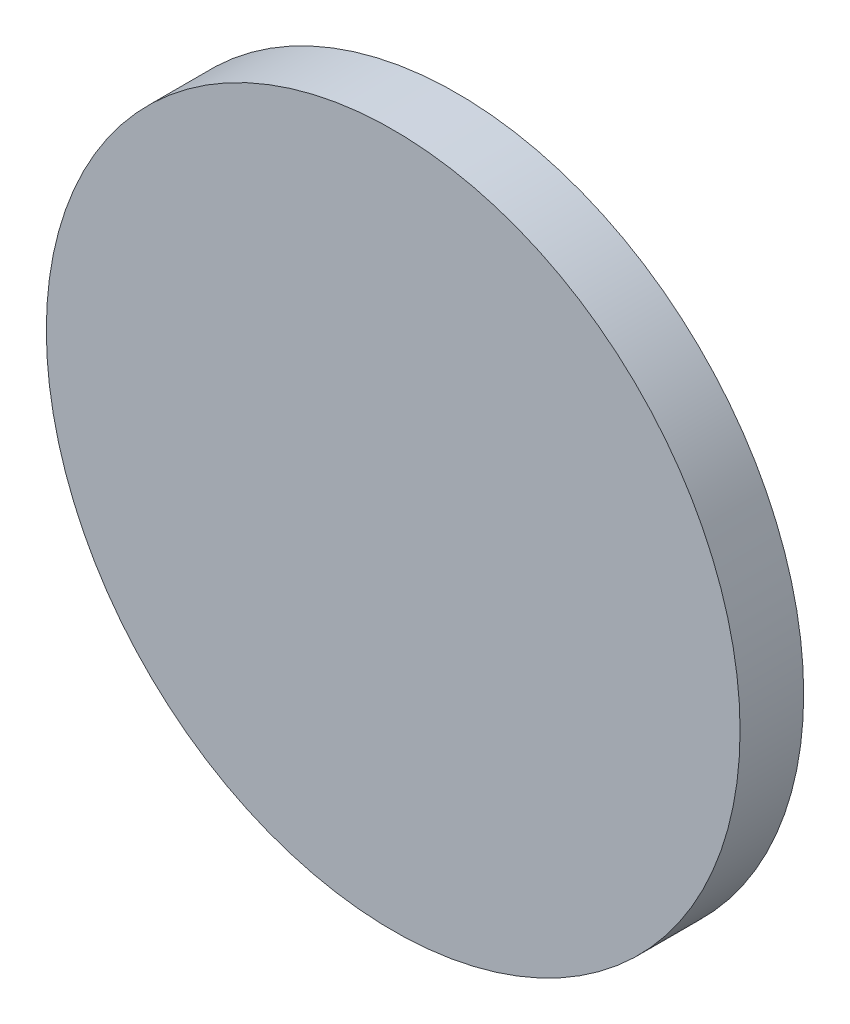
ISO-10303-21;
HEADER;
FILE_DESCRIPTION(('STEP AP214'),'2;1');
FILE_NAME('part.step','',(''),(''),'','','');
FILE_SCHEMA(('AUTOMOTIVE_DESIGN { 1 0 10303 214 1 1 1 1 }'));
ENDSEC;
DATA;
#1=APPLICATION_CONTEXT('core data for automotive mechanical design processes');
#2=APPLICATION_PROTOCOL_DEFINITION('international standard','automotive_design',2000,#1);
#3=PRODUCT_CONTEXT('',#1,'mechanical');
#4=PRODUCT('Part','Part','',(#3));
#5=PRODUCT_RELATED_PRODUCT_CATEGORY('part','',(#4));
#6=PRODUCT_DEFINITION_FORMATION('','',#4);
#7=PRODUCT_DEFINITION_CONTEXT('part definition',#1,'design');
#8=PRODUCT_DEFINITION('design','',#6,#7);
#9=PRODUCT_DEFINITION_SHAPE('','',#8);
#10=(LENGTH_UNIT() NAMED_UNIT(*) SI_UNIT(.MILLI.,.METRE.));
#11=(NAMED_UNIT(*) PLANE_ANGLE_UNIT() SI_UNIT($,.RADIAN.));
#12=(NAMED_UNIT(*) SI_UNIT($,.STERADIAN.) SOLID_ANGLE_UNIT());
#13=UNCERTAINTY_MEASURE_WITH_UNIT(LENGTH_MEASURE(1.E-05),#10,'distance_accuracy_value','');
#14=(GEOMETRIC_REPRESENTATION_CONTEXT(3) GLOBAL_UNCERTAINTY_ASSIGNED_CONTEXT((#13)) GLOBAL_UNIT_ASSIGNED_CONTEXT((#10,
#11,#12)) REPRESENTATION_CONTEXT('',''));
#15=CARTESIAN_POINT('',(0.,0.,0.));
#16=DIRECTION('',(0.,0.,1.));
#17=DIRECTION('',(1.,0.,0.));
#18=AXIS2_PLACEMENT_3D('',#15,#16,#17);
#19=CARTESIAN_POINT('',(0.,0.,5.5));
#20=DIRECTION('',(0.,0.,-1.));
#21=DIRECTION('',(-1.,0.,0.));
#22=AXIS2_PLACEMENT_3D('',#19,#20,#21);
#23=CYLINDRICAL_SURFACE('',#22,30.);
#24=CARTESIAN_POINT('',(0.,0.,5.5));
#25=DIRECTION('',(0.,0.,1.));
#26=DIRECTION('',(1.,0.,0.));
#27=AXIS2_PLACEMENT_3D('',#24,#25,#26);
#28=CIRCLE('',#27,30.);
#29=CARTESIAN_POINT('',(30.,0.,5.5));
#30=VERTEX_POINT('',#29);
#31=EDGE_CURVE('E10',#30,#30,#28,.T.);
#32=ORIENTED_EDGE('',*,*,#31,.F.);
#33=EDGE_LOOP('',(#32));
#34=FACE_BOUND('',#33,.T.);
#35=CARTESIAN_POINT('',(0.,0.,0.));
#36=DIRECTION('',(0.,0.,1.));
#37=DIRECTION('',(1.,0.,0.));
#38=AXIS2_PLACEMENT_3D('',#35,#36,#37);
#39=CIRCLE('',#38,30.);
#40=CARTESIAN_POINT('',(30.,0.,0.));
#41=VERTEX_POINT('',#40);
#42=EDGE_CURVE('E40',#41,#41,#39,.T.);
#43=ORIENTED_EDGE('',*,*,#42,.T.);
#44=EDGE_LOOP('',(#43));
#45=FACE_BOUND('',#44,.T.);
#46=ADVANCED_FACE('F37',(#34,#45),#23,.T.);
#47=CARTESIAN_POINT('',(0.,0.,5.5));
#48=DIRECTION('',(0.,0.,1.));
#49=DIRECTION('',(1.,0.,0.));
#50=AXIS2_PLACEMENT_3D('',#47,#48,#49);
#51=PLANE('',#50);
#52=ORIENTED_EDGE('',*,*,#31,.T.);
#53=EDGE_LOOP('',(#52));
#54=FACE_BOUND('',#53,.T.);
#55=ADVANCED_FACE('F70',(#54),#51,.T.);
#56=CARTESIAN_POINT('',(0.,0.,0.));
#57=DIRECTION('',(0.,0.,1.));
#58=DIRECTION('',(1.,0.,0.));
#59=AXIS2_PLACEMENT_3D('',#56,#57,#58);
#60=PLANE('',#59);
#61=CARTESIAN_POINT('',(0.,0.,0.));
#62=DIRECTION('',(0.,0.,-1.));
#63=DIRECTION('',(-1.,0.,0.));
#64=AXIS2_PLACEMENT_3D('',#61,#62,#63);
#65=CIRCLE('',#64,2.5);
#66=CARTESIAN_POINT('',(-2.5,0.,0.));
#67=VERTEX_POINT('',#66);
#68=EDGE_CURVE('E51',#67,#67,#65,.T.);
#69=ORIENTED_EDGE('',*,*,#68,.F.);
#70=EDGE_LOOP('',(#69));
#71=FACE_BOUND('',#70,.T.);
#72=ORIENTED_EDGE('',*,*,#42,.F.);
#73=EDGE_LOOP('',(#72));
#74=FACE_BOUND('',#73,.T.);
#75=ADVANCED_FACE('F64',(#71,#74),#60,.F.);
#76=CARTESIAN_POINT('',(0.,0.,2.));
#77=DIRECTION('',(0.,0.,-1.));
#78=DIRECTION('',(-1.,0.,0.));
#79=AXIS2_PLACEMENT_3D('',#76,#77,#78);
#80=CYLINDRICAL_SURFACE('',#79,2.5);
#81=CARTESIAN_POINT('',(0.,0.,2.));
#82=DIRECTION('',(0.,0.,-1.));
#83=DIRECTION('',(-1.,0.,0.));
#84=AXIS2_PLACEMENT_3D('',#81,#82,#83);
#85=CIRCLE('',#84,2.5);
#86=CARTESIAN_POINT('',(-2.5,0.,2.));
#87=VERTEX_POINT('',#86);
#88=EDGE_CURVE('E49',#87,#87,#85,.T.);
#89=ORIENTED_EDGE('',*,*,#88,.F.);
#90=EDGE_LOOP('',(#89));
#91=FACE_BOUND('',#90,.T.);
#92=ORIENTED_EDGE('',*,*,#68,.T.);
#93=EDGE_LOOP('',(#92));
#94=FACE_BOUND('',#93,.T.);
#95=ADVANCED_FACE('F61',(#91,#94),#80,.F.);
#96=CARTESIAN_POINT('',(0.,0.,2.));
#97=DIRECTION('',(0.,0.,-1.));
#98=DIRECTION('',(-1.,0.,0.));
#99=AXIS2_PLACEMENT_3D('',#96,#97,#98);
#100=PLANE('',#99);
#101=ORIENTED_EDGE('',*,*,#88,.T.);
#102=EDGE_LOOP('',(#101));
#103=FACE_BOUND('',#102,.T.);
#104=ADVANCED_FACE('F59',(#103),#100,.T.);
#105=CLOSED_SHELL('',(#46,#55,#75,#95,#104));
#106=MANIFOLD_SOLID_BREP('B2',#105);
#107=ADVANCED_BREP_SHAPE_REPRESENTATION('',(#18,#106),#14);
#108=SHAPE_DEFINITION_REPRESENTATION(#9,#107);
ENDSEC;
END-ISO-10303-21;
